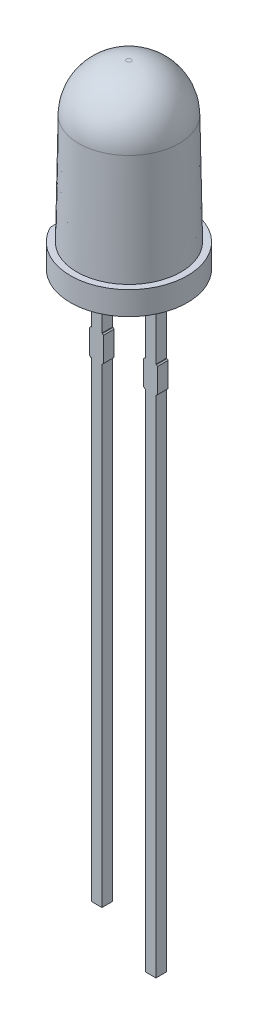
ISO-10303-21;
HEADER;
FILE_DESCRIPTION(('STEP AP214'),'2;1');
FILE_NAME('part.step','',(''),(''),'','','');
FILE_SCHEMA(('AUTOMOTIVE_DESIGN { 1 0 10303 214 1 1 1 1 }'));
ENDSEC;
DATA;
#1=APPLICATION_CONTEXT('core data for automotive mechanical design processes');
#2=APPLICATION_PROTOCOL_DEFINITION('international standard','automotive_design',2000,#1);
#3=PRODUCT_CONTEXT('',#1,'mechanical');
#4=PRODUCT('Part','Part','',(#3));
#5=PRODUCT_RELATED_PRODUCT_CATEGORY('part','',(#4));
#6=PRODUCT_DEFINITION_FORMATION('','',#4);
#7=PRODUCT_DEFINITION_CONTEXT('part definition',#1,'design');
#8=PRODUCT_DEFINITION('design','',#6,#7);
#9=PRODUCT_DEFINITION_SHAPE('','',#8);
#10=(LENGTH_UNIT() NAMED_UNIT(*) SI_UNIT(.MILLI.,.METRE.));
#11=(NAMED_UNIT(*) PLANE_ANGLE_UNIT() SI_UNIT($,.RADIAN.));
#12=(NAMED_UNIT(*) SI_UNIT($,.STERADIAN.) SOLID_ANGLE_UNIT());
#13=UNCERTAINTY_MEASURE_WITH_UNIT(LENGTH_MEASURE(1.E-05),#10,'distance_accuracy_value','');
#14=(GEOMETRIC_REPRESENTATION_CONTEXT(3) GLOBAL_UNCERTAINTY_ASSIGNED_CONTEXT((#13)) GLOBAL_UNIT_ASSIGNED_CONTEXT((#10,
#11,#12)) REPRESENTATION_CONTEXT('',''));
#15=CARTESIAN_POINT('',(0.,0.,0.));
#16=DIRECTION('',(0.,0.,1.));
#17=DIRECTION('',(1.,0.,0.));
#18=AXIS2_PLACEMENT_3D('',#15,#16,#17);
#19=CARTESIAN_POINT('',(-1.02,-28.,0.25));
#20=DIRECTION('',(-1.,0.,0.));
#21=DIRECTION('',(0.,0.,1.));
#22=AXIS2_PLACEMENT_3D('',#19,#20,#21);
#23=PLANE('',#22);
#24=DIRECTION('',(0.,1.,0.));
#25=VECTOR('',#24,1.);
#26=CARTESIAN_POINT('',(-1.02,-28.,0.25));
#27=LINE('',#26,#25);
#28=CARTESIAN_POINT('',(-1.02,-3.,0.25));
#29=VERTEX_POINT('',#28);
#30=CARTESIAN_POINT('',(-1.02,0.,0.25));
#31=VERTEX_POINT('',#30);
#32=EDGE_CURVE('E312',#29,#31,#27,.T.);
#33=ORIENTED_EDGE('',*,*,#32,.F.);
#34=DIRECTION('',(0.,0.,-1.));
#35=VECTOR('',#34,1.);
#36=CARTESIAN_POINT('',(-1.02,-3.,0.25));
#37=LINE('',#36,#35);
#38=CARTESIAN_POINT('',(-1.02,-3.,-0.25));
#39=VERTEX_POINT('',#38);
#40=EDGE_CURVE('E545',#29,#39,#37,.T.);
#41=ORIENTED_EDGE('',*,*,#40,.T.);
#42=DIRECTION('',(0.,1.,0.));
#43=VECTOR('',#42,1.);
#44=CARTESIAN_POINT('',(-1.02,-28.,-0.25));
#45=LINE('',#44,#43);
#46=CARTESIAN_POINT('',(-1.02,0.,-0.25));
#47=VERTEX_POINT('',#46);
#48=EDGE_CURVE('E361',#39,#47,#45,.T.);
#49=ORIENTED_EDGE('',*,*,#48,.T.);
#50=DIRECTION('',(0.,0.,1.));
#51=VECTOR('',#50,1.);
#52=CARTESIAN_POINT('',(-1.02,0.,0.25));
#53=LINE('',#52,#51);
#54=EDGE_CURVE('E478',#47,#31,#53,.T.);
#55=ORIENTED_EDGE('',*,*,#54,.T.);
#56=EDGE_LOOP('',(#33,#41,#49,#55));
#57=FACE_BOUND('',#56,.T.);
#58=ADVANCED_FACE('F41',(#57),#23,.F.);
#59=CARTESIAN_POINT('',(-1.52,-28.,0.25));
#60=DIRECTION('',(1.,0.,0.));
#61=DIRECTION('',(0.,0.,-1.));
#62=AXIS2_PLACEMENT_3D('',#59,#60,#61);
#63=PLANE('',#62);
#64=DIRECTION('',(0.,1.,0.));
#65=VECTOR('',#64,1.);
#66=CARTESIAN_POINT('',(-1.52,-28.,-0.25));
#67=LINE('',#66,#65);
#68=CARTESIAN_POINT('',(-1.52,-3.,-0.25));
#69=VERTEX_POINT('',#68);
#70=CARTESIAN_POINT('',(-1.52,0.,-0.25));
#71=VERTEX_POINT('',#70);
#72=EDGE_CURVE('E300',#69,#71,#67,.T.);
#73=ORIENTED_EDGE('',*,*,#72,.F.);
#74=DIRECTION('',(0.,0.,1.));
#75=VECTOR('',#74,1.);
#76=CARTESIAN_POINT('',(-1.52,-3.,0.25));
#77=LINE('',#76,#75);
#78=CARTESIAN_POINT('',(-1.52,-3.,0.25));
#79=VERTEX_POINT('',#78);
#80=EDGE_CURVE('E547',#69,#79,#77,.T.);
#81=ORIENTED_EDGE('',*,*,#80,.T.);
#82=DIRECTION('',(0.,1.,0.));
#83=VECTOR('',#82,1.);
#84=CARTESIAN_POINT('',(-1.52,-28.,0.25));
#85=LINE('',#84,#83);
#86=CARTESIAN_POINT('',(-1.52,0.,0.25));
#87=VERTEX_POINT('',#86);
#88=EDGE_CURVE('E299',#79,#87,#85,.T.);
#89=ORIENTED_EDGE('',*,*,#88,.T.);
#90=DIRECTION('',(0.,0.,-1.));
#91=VECTOR('',#90,1.);
#92=CARTESIAN_POINT('',(-1.52,0.,0.25));
#93=LINE('',#92,#91);
#94=EDGE_CURVE('E494',#87,#71,#93,.T.);
#95=ORIENTED_EDGE('',*,*,#94,.T.);
#96=EDGE_LOOP('',(#73,#81,#89,#95));
#97=FACE_BOUND('',#96,.T.);
#98=ADVANCED_FACE('F619',(#97),#63,.F.);
#99=CARTESIAN_POINT('',(1.52,-28.,0.25));
#100=DIRECTION('',(-1.,0.,0.));
#101=DIRECTION('',(0.,0.,1.));
#102=AXIS2_PLACEMENT_3D('',#99,#100,#101);
#103=PLANE('',#102);
#104=DIRECTION('',(0.,1.,0.));
#105=VECTOR('',#104,1.);
#106=CARTESIAN_POINT('',(1.52,-28.,0.25));
#107=LINE('',#106,#105);
#108=CARTESIAN_POINT('',(1.52,-3.,0.25));
#109=VERTEX_POINT('',#108);
#110=CARTESIAN_POINT('',(1.52,0.,0.25));
#111=VERTEX_POINT('',#110);
#112=EDGE_CURVE('E529',#109,#111,#107,.T.);
#113=ORIENTED_EDGE('',*,*,#112,.F.);
#114=DIRECTION('',(0.,0.,-1.));
#115=VECTOR('',#114,1.);
#116=CARTESIAN_POINT('',(1.52,-3.,0.25));
#117=LINE('',#116,#115);
#118=CARTESIAN_POINT('',(1.52,-3.,-0.25));
#119=VERTEX_POINT('',#118);
#120=EDGE_CURVE('E561',#109,#119,#117,.T.);
#121=ORIENTED_EDGE('',*,*,#120,.T.);
#122=DIRECTION('',(0.,1.,0.));
#123=VECTOR('',#122,1.);
#124=CARTESIAN_POINT('',(1.52,-28.,-0.25));
#125=LINE('',#124,#123);
#126=CARTESIAN_POINT('',(1.52,0.,-0.25));
#127=VERTEX_POINT('',#126);
#128=EDGE_CURVE('E536',#119,#127,#125,.T.);
#129=ORIENTED_EDGE('',*,*,#128,.T.);
#130=DIRECTION('',(0.,0.,1.));
#131=VECTOR('',#130,1.);
#132=CARTESIAN_POINT('',(1.52,0.,0.25));
#133=LINE('',#132,#131);
#134=EDGE_CURVE('E509',#127,#111,#133,.T.);
#135=ORIENTED_EDGE('',*,*,#134,.T.);
#136=EDGE_LOOP('',(#113,#121,#129,#135));
#137=FACE_BOUND('',#136,.T.);
#138=ADVANCED_FACE('F709',(#137),#103,.F.);
#139=CARTESIAN_POINT('',(1.02,-28.,0.25));
#140=DIRECTION('',(1.,0.,0.));
#141=DIRECTION('',(0.,0.,-1.));
#142=AXIS2_PLACEMENT_3D('',#139,#140,#141);
#143=PLANE('',#142);
#144=DIRECTION('',(0.,1.,0.));
#145=VECTOR('',#144,1.);
#146=CARTESIAN_POINT('',(1.02,-28.,-0.25));
#147=LINE('',#146,#145);
#148=CARTESIAN_POINT('',(1.02,-3.,-0.25));
#149=VERTEX_POINT('',#148);
#150=CARTESIAN_POINT('',(1.02,0.,-0.25));
#151=VERTEX_POINT('',#150);
#152=EDGE_CURVE('E535',#149,#151,#147,.T.);
#153=ORIENTED_EDGE('',*,*,#152,.F.);
#154=DIRECTION('',(0.,0.,1.));
#155=VECTOR('',#154,1.);
#156=CARTESIAN_POINT('',(1.02,-3.,0.25));
#157=LINE('',#156,#155);
#158=CARTESIAN_POINT('',(1.02,-3.,0.25));
#159=VERTEX_POINT('',#158);
#160=EDGE_CURVE('E486',#149,#159,#157,.T.);
#161=ORIENTED_EDGE('',*,*,#160,.T.);
#162=DIRECTION('',(0.,1.,0.));
#163=VECTOR('',#162,1.);
#164=CARTESIAN_POINT('',(1.02,-28.,0.25));
#165=LINE('',#164,#163);
#166=CARTESIAN_POINT('',(1.02,0.,0.25));
#167=VERTEX_POINT('',#166);
#168=EDGE_CURVE('E473',#159,#167,#165,.T.);
#169=ORIENTED_EDGE('',*,*,#168,.T.);
#170=DIRECTION('',(0.,0.,-1.));
#171=VECTOR('',#170,1.);
#172=CARTESIAN_POINT('',(1.02,0.,0.25));
#173=LINE('',#172,#171);
#174=EDGE_CURVE('E508',#167,#151,#173,.T.);
#175=ORIENTED_EDGE('',*,*,#174,.T.);
#176=EDGE_LOOP('',(#153,#161,#169,#175));
#177=FACE_BOUND('',#176,.T.);
#178=ADVANCED_FACE('F722',(#177),#143,.F.);
#179=CARTESIAN_POINT('',(0.,0.,0.));
#180=DIRECTION('',(0.,1.,0.));
#181=DIRECTION('',(0.,0.,1.));
#182=AXIS2_PLACEMENT_3D('',#179,#180,#181);
#183=PLANE('',#182);
#184=ORIENTED_EDGE('',*,*,#54,.F.);
#185=DIRECTION('',(1.,0.,0.));
#186=VECTOR('',#185,1.);
#187=CARTESIAN_POINT('',(-1.52,0.,-0.25));
#188=LINE('',#187,#186);
#189=EDGE_CURVE('E358',#71,#47,#188,.T.);
#190=ORIENTED_EDGE('',*,*,#189,.F.);
#191=ORIENTED_EDGE('',*,*,#94,.F.);
#192=DIRECTION('',(-1.,0.,0.));
#193=VECTOR('',#192,1.);
#194=CARTESIAN_POINT('',(-1.52,0.,0.25));
#195=LINE('',#194,#193);
#196=EDGE_CURVE('E481',#31,#87,#195,.T.);
#197=ORIENTED_EDGE('',*,*,#196,.F.);
#198=EDGE_LOOP('',(#184,#190,#191,#197));
#199=FACE_BOUND('',#198,.T.);
#200=CARTESIAN_POINT('',(0.,0.,0.));
#201=DIRECTION('',(0.,1.,0.));
#202=DIRECTION('',(0.,0.,1.));
#203=AXIS2_PLACEMENT_3D('',#200,#201,#202);
#204=CIRCLE('',#203,2.75);
#205=CARTESIAN_POINT('',(-2.45,0.,1.24899959967968));
#206=VERTEX_POINT('',#205);
#207=CARTESIAN_POINT('',(-2.45,0.,-1.24899959967968));
#208=VERTEX_POINT('',#207);
#209=EDGE_CURVE('E330',#206,#208,#204,.T.);
#210=ORIENTED_EDGE('',*,*,#209,.F.);
#211=DIRECTION('',(0.,0.,-1.));
#212=VECTOR('',#211,1.);
#213=CARTESIAN_POINT('',(-2.45,0.,-1.24899959967968));
#214=LINE('',#213,#212);
#215=EDGE_CURVE('E318',#206,#208,#214,.T.);
#216=ORIENTED_EDGE('',*,*,#215,.T.);
#217=EDGE_LOOP('',(#210,#216));
#218=FACE_BOUND('',#217,.T.);
#219=ORIENTED_EDGE('',*,*,#134,.F.);
#220=DIRECTION('',(1.,0.,0.));
#221=VECTOR('',#220,1.);
#222=CARTESIAN_POINT('',(1.02,0.,-0.25));
#223=LINE('',#222,#221);
#224=EDGE_CURVE('E524',#151,#127,#223,.T.);
#225=ORIENTED_EDGE('',*,*,#224,.F.);
#226=ORIENTED_EDGE('',*,*,#174,.F.);
#227=DIRECTION('',(-1.,0.,0.));
#228=VECTOR('',#227,1.);
#229=CARTESIAN_POINT('',(1.02,0.,0.25));
#230=LINE('',#229,#228);
#231=EDGE_CURVE('E505',#111,#167,#230,.T.);
#232=ORIENTED_EDGE('',*,*,#231,.F.);
#233=EDGE_LOOP('',(#219,#225,#226,#232));
#234=FACE_BOUND('',#233,.T.);
#235=ADVANCED_FACE('F626',(#199,#218,#234),#183,.F.);
#236=CARTESIAN_POINT('',(0.,1.1,0.));
#237=DIRECTION('',(0.,-1.,0.));
#238=DIRECTION('',(0.,0.,-1.));
#239=AXIS2_PLACEMENT_3D('',#236,#237,#238);
#240=CYLINDRICAL_SURFACE('',#239,2.75);
#241=CARTESIAN_POINT('',(0.,1.1,0.));
#242=DIRECTION('',(0.,1.,0.));
#243=DIRECTION('',(0.,0.,1.));
#244=AXIS2_PLACEMENT_3D('',#241,#242,#243);
#245=CIRCLE('',#244,2.75);
#246=CARTESIAN_POINT('',(-2.45,1.1,1.24899959967968));
#247=VERTEX_POINT('',#246);
#248=CARTESIAN_POINT('',(-2.45,1.1,-1.24899959967968));
#249=VERTEX_POINT('',#248);
#250=EDGE_CURVE('E338',#247,#249,#245,.T.);
#251=ORIENTED_EDGE('',*,*,#250,.F.);
#252=DIRECTION('',(0.,1.,0.));
#253=VECTOR('',#252,1.);
#254=CARTESIAN_POINT('',(-2.45,0.,1.24899959967968));
#255=LINE('',#254,#253);
#256=EDGE_CURVE('E322',#206,#247,#255,.T.);
#257=ORIENTED_EDGE('',*,*,#256,.F.);
#258=ORIENTED_EDGE('',*,*,#209,.T.);
#259=DIRECTION('',(0.,1.,0.));
#260=VECTOR('',#259,1.);
#261=CARTESIAN_POINT('',(-2.45,0.,-1.24899959967968));
#262=LINE('',#261,#260);
#263=EDGE_CURVE('E326',#208,#249,#262,.T.);
#264=ORIENTED_EDGE('',*,*,#263,.T.);
#265=EDGE_LOOP('',(#251,#257,#258,#264));
#266=FACE_BOUND('',#265,.T.);
#267=ADVANCED_FACE('F682',(#266),#240,.T.);
#268=CARTESIAN_POINT('',(0.,1.1,0.));
#269=DIRECTION('',(0.,1.,0.));
#270=DIRECTION('',(0.,0.,1.));
#271=AXIS2_PLACEMENT_3D('',#268,#269,#270);
#272=PLANE('',#271);
#273=DIRECTION('',(0.,0.,-1.));
#274=VECTOR('',#273,1.);
#275=CARTESIAN_POINT('',(-2.45,1.1,-1.24899959967968));
#276=LINE('',#275,#274);
#277=CARTESIAN_POINT('',(-2.45,1.1,0.));
#278=VERTEX_POINT('',#277);
#279=EDGE_CURVE('E323',#247,#278,#276,.T.);
#280=ORIENTED_EDGE('',*,*,#279,.F.);
#281=ORIENTED_EDGE('',*,*,#250,.T.);
#282=EDGE_CURVE('E317',#278,#249,#276,.T.);
#283=ORIENTED_EDGE('',*,*,#282,.F.);
#284=CARTESIAN_POINT('',(0.,1.1,0.));
#285=DIRECTION('',(0.,1.,0.));
#286=DIRECTION('',(0.,0.,1.));
#287=AXIS2_PLACEMENT_3D('',#284,#285,#286);
#288=CIRCLE('',#287,2.45);
#289=EDGE_CURVE('E333',#278,#278,#288,.T.);
#290=ORIENTED_EDGE('',*,*,#289,.F.);
#291=EDGE_LOOP('',(#280,#281,#283,#290));
#292=FACE_BOUND('',#291,.T.);
#293=ADVANCED_FACE('F685',(#292),#272,.T.);
#294=CARTESIAN_POINT('',(0.,8.5,0.));
#295=DIRECTION('',(0.,1.,0.));
#296=DIRECTION('',(0.,0.,1.));
#297=AXIS2_PLACEMENT_3D('',#294,#295,#296);
#298=PLANE('',#297);
#299=CARTESIAN_POINT('',(0.,8.5,0.));
#300=DIRECTION('',(0.,1.,0.));
#301=DIRECTION('',(0.,0.,1.));
#302=AXIS2_PLACEMENT_3D('',#299,#300,#301);
#303=CIRCLE('',#302,0.109763677520888);
#304=CARTESIAN_POINT('',(0.,8.5,0.109763677520888));
#305=VERTEX_POINT('',#304);
#306=EDGE_CURVE('E337',#305,#305,#303,.T.);
#307=ORIENTED_EDGE('',*,*,#306,.T.);
#308=EDGE_LOOP('',(#307));
#309=FACE_BOUND('',#308,.T.);
#310=ADVANCED_FACE('F690',(#309),#298,.T.);
#311=CARTESIAN_POINT('',(0.,1.1,0.));
#312=DIRECTION('',(0.,-1.,0.));
#313=DIRECTION('',(0.,0.,1.));
#314=AXIS2_PLACEMENT_3D('',#311,#312,#313);
#315=CONICAL_SURFACE('',#314,2.45,0.0174532925199433);
#316=CARTESIAN_POINT('',(0.,6.28926791448389,0.));
#317=DIRECTION('',(0.,1.,0.));
#318=DIRECTION('',(0.,0.,1.));
#319=AXIS2_PLACEMENT_3D('',#316,#317,#318);
#320=CIRCLE('',#319,2.35942099162277);
#321=CARTESIAN_POINT('',(0.,6.28926791448389,2.35942099162277));
#322=VERTEX_POINT('',#321);
#323=EDGE_CURVE('E348',#322,#322,#320,.F.);
#324=ORIENTED_EDGE('',*,*,#323,.T.);
#325=EDGE_LOOP('',(#324));
#326=FACE_BOUND('',#325,.T.);
#327=ORIENTED_EDGE('',*,*,#289,.T.);
#328=EDGE_LOOP('',(#327));
#329=FACE_BOUND('',#328,.T.);
#330=ADVANCED_FACE('F687',(#326,#329),#315,.T.);
#331=CARTESIAN_POINT('',(0.,6.25,0.));
#332=DIRECTION('',(0.,1.,0.));
#333=DIRECTION('',(0.,0.,1.));
#334=AXIS2_PLACEMENT_3D('',#331,#332,#333);
#335=DEGENERATE_TOROIDAL_SURFACE('',#334,0.109763677520888,2.25,.T.);
#336=ORIENTED_EDGE('',*,*,#323,.F.);
#337=EDGE_LOOP('',(#336));
#338=FACE_BOUND('',#337,.T.);
#339=ORIENTED_EDGE('',*,*,#306,.F.);
#340=EDGE_LOOP('',(#339));
#341=FACE_BOUND('',#340,.T.);
#342=ADVANCED_FACE('F689',(#338,#341),#335,.T.);
#343=CARTESIAN_POINT('',(-2.45,0.,-1.24899959967968));
#344=DIRECTION('',(1.,0.,0.));
#345=DIRECTION('',(0.,0.,-1.));
#346=AXIS2_PLACEMENT_3D('',#343,#344,#345);
#347=PLANE('',#346);
#348=ORIENTED_EDGE('',*,*,#279,.T.);
#349=ORIENTED_EDGE('',*,*,#282,.T.);
#350=ORIENTED_EDGE('',*,*,#263,.F.);
#351=ORIENTED_EDGE('',*,*,#215,.F.);
#352=ORIENTED_EDGE('',*,*,#256,.T.);
#353=EDGE_LOOP('',(#348,#349,#350,#351,#352));
#354=FACE_BOUND('',#353,.T.);
#355=ADVANCED_FACE('F676',(#354),#347,.F.);
#356=CARTESIAN_POINT('',(-1.02,-26.4,-0.25));
#357=VERTEX_POINT('',#356);
#358=CARTESIAN_POINT('',(-1.02,-4.25,-0.25));
#359=VERTEX_POINT('',#358);
#360=EDGE_CURVE('E307',#357,#359,#45,.T.);
#361=ORIENTED_EDGE('',*,*,#360,.T.);
#362=DIRECTION('',(0.,0.,1.));
#363=VECTOR('',#362,1.);
#364=CARTESIAN_POINT('',(-1.02,-4.25,0.25));
#365=LINE('',#364,#363);
#366=CARTESIAN_POINT('',(-1.02,-4.25,0.25));
#367=VERTEX_POINT('',#366);
#368=EDGE_CURVE('E292',#359,#367,#365,.T.);
#369=ORIENTED_EDGE('',*,*,#368,.T.);
#370=CARTESIAN_POINT('',(-1.02,-26.4,0.25));
#371=VERTEX_POINT('',#370);
#372=EDGE_CURVE('E313',#371,#367,#27,.T.);
#373=ORIENTED_EDGE('',*,*,#372,.F.);
#374=DIRECTION('',(0.,0.,1.));
#375=VECTOR('',#374,1.);
#376=CARTESIAN_POINT('',(-1.02,-26.4,0.25));
#377=LINE('',#376,#375);
#378=EDGE_CURVE('E353',#357,#371,#377,.T.);
#379=ORIENTED_EDGE('',*,*,#378,.F.);
#380=EDGE_LOOP('',(#361,#369,#373,#379));
#381=FACE_BOUND('',#380,.T.);
#382=ADVANCED_FACE('F656',(#381),#23,.F.);
#383=CARTESIAN_POINT('',(-1.52,-28.,0.25));
#384=DIRECTION('',(0.,0.,-1.));
#385=DIRECTION('',(-1.,0.,0.));
#386=AXIS2_PLACEMENT_3D('',#383,#384,#385);
#387=PLANE('',#386);
#388=DIRECTION('',(1.,0.,0.));
#389=VECTOR('',#388,1.);
#390=CARTESIAN_POINT('',(-1.595,-4.25,0.25));
#391=LINE('',#390,#389);
#392=CARTESIAN_POINT('',(-0.994999999999997,-4.25,0.25));
#393=VERTEX_POINT('',#392);
#394=EDGE_CURVE('E520',#367,#393,#391,.T.);
#395=ORIENTED_EDGE('',*,*,#394,.T.);
#396=DIRECTION('',(-0.707106781186548,-0.707106781186548,0.));
#397=VECTOR('',#396,1.);
#398=CARTESIAN_POINT('',(-0.994999999999997,-4.25,0.25));
#399=LINE('',#398,#397);
#400=CARTESIAN_POINT('',(-0.944999999999999,-4.2,0.25));
#401=VERTEX_POINT('',#400);
#402=EDGE_CURVE('E430',#393,#401,#399,.F.);
#403=ORIENTED_EDGE('',*,*,#402,.T.);
#404=DIRECTION('',(0.,1.,0.));
#405=VECTOR('',#404,1.);
#406=CARTESIAN_POINT('',(-0.945,-3.,0.25));
#407=LINE('',#406,#405);
#408=CARTESIAN_POINT('',(-0.945,-3.05,0.25));
#409=VERTEX_POINT('',#408);
#410=EDGE_CURVE('E467',#401,#409,#407,.T.);
#411=ORIENTED_EDGE('',*,*,#410,.T.);
#412=DIRECTION('',(0.707106781186547,-0.707106781186548,0.));
#413=VECTOR('',#412,1.);
#414=CARTESIAN_POINT('',(-0.945,-3.05,0.25));
#415=LINE('',#414,#413);
#416=CARTESIAN_POINT('',(-0.994999999999994,-3.,0.25));
#417=VERTEX_POINT('',#416);
#418=EDGE_CURVE('E427',#409,#417,#415,.F.);
#419=ORIENTED_EDGE('',*,*,#418,.T.);
#420=DIRECTION('',(-1.,0.,0.));
#421=VECTOR('',#420,1.);
#422=CARTESIAN_POINT('',(-1.595,-3.,0.25));
#423=LINE('',#422,#421);
#424=EDGE_CURVE('E501',#417,#29,#423,.T.);
#425=ORIENTED_EDGE('',*,*,#424,.T.);
#426=ORIENTED_EDGE('',*,*,#32,.T.);
#427=ORIENTED_EDGE('',*,*,#196,.T.);
#428=ORIENTED_EDGE('',*,*,#88,.F.);
#429=CARTESIAN_POINT('',(-1.54499999999999,-3.,0.25));
#430=VERTEX_POINT('',#429);
#431=EDGE_CURVE('E469',#79,#430,#423,.T.);
#432=ORIENTED_EDGE('',*,*,#431,.T.);
#433=DIRECTION('',(0.707106781186572,0.707106781186523,0.));
#434=VECTOR('',#433,1.);
#435=CARTESIAN_POINT('',(-1.54499999999999,-3.,0.25));
#436=LINE('',#435,#434);
#437=CARTESIAN_POINT('',(-1.595,-3.05,0.25));
#438=VERTEX_POINT('',#437);
#439=EDGE_CURVE('E422',#430,#438,#436,.F.);
#440=ORIENTED_EDGE('',*,*,#439,.T.);
#441=DIRECTION('',(0.,-1.,0.));
#442=VECTOR('',#441,1.);
#443=CARTESIAN_POINT('',(-1.595,-3.,0.25));
#444=LINE('',#443,#442);
#445=CARTESIAN_POINT('',(-1.595,-4.2,0.25));
#446=VERTEX_POINT('',#445);
#447=EDGE_CURVE('E518',#438,#446,#444,.T.);
#448=ORIENTED_EDGE('',*,*,#447,.T.);
#449=DIRECTION('',(-0.707106781186572,0.707106781186523,0.));
#450=VECTOR('',#449,1.);
#451=CARTESIAN_POINT('',(-1.595,-4.2,0.25));
#452=LINE('',#451,#450);
#453=CARTESIAN_POINT('',(-1.545,-4.25,0.25));
#454=VERTEX_POINT('',#453);
#455=EDGE_CURVE('E425',#446,#454,#452,.F.);
#456=ORIENTED_EDGE('',*,*,#455,.T.);
#457=CARTESIAN_POINT('',(-1.52,-4.25,0.25));
#458=VERTEX_POINT('',#457);
#459=EDGE_CURVE('E470',#454,#458,#391,.T.);
#460=ORIENTED_EDGE('',*,*,#459,.T.);
#461=CARTESIAN_POINT('',(-1.52,-26.4,0.25));
#462=VERTEX_POINT('',#461);
#463=EDGE_CURVE('E290',#462,#458,#85,.T.);
#464=ORIENTED_EDGE('',*,*,#463,.F.);
#465=DIRECTION('',(-1.,0.,0.));
#466=VECTOR('',#465,1.);
#467=CARTESIAN_POINT('',(-1.52,-26.4,0.25));
#468=LINE('',#467,#466);
#469=EDGE_CURVE('E357',#371,#462,#468,.T.);
#470=ORIENTED_EDGE('',*,*,#469,.F.);
#471=ORIENTED_EDGE('',*,*,#372,.T.);
#472=EDGE_LOOP('',(#395,#403,#411,#419,#425,#426,#427,#428,#432,#440,#448,#456,#460,#464,#470,#471));
#473=FACE_BOUND('',#472,.T.);
#474=ADVANCED_FACE('F629',(#473),#387,.F.);
#475=ORIENTED_EDGE('',*,*,#463,.T.);
#476=DIRECTION('',(0.,0.,-1.));
#477=VECTOR('',#476,1.);
#478=CARTESIAN_POINT('',(-1.52,-4.25,0.25));
#479=LINE('',#478,#477);
#480=CARTESIAN_POINT('',(-1.52,-4.25,-0.25));
#481=VERTEX_POINT('',#480);
#482=EDGE_CURVE('E274',#458,#481,#479,.T.);
#483=ORIENTED_EDGE('',*,*,#482,.T.);
#484=CARTESIAN_POINT('',(-1.52,-26.4,-0.25));
#485=VERTEX_POINT('',#484);
#486=EDGE_CURVE('E287',#485,#481,#67,.T.);
#487=ORIENTED_EDGE('',*,*,#486,.F.);
#488=DIRECTION('',(0.,0.,-1.));
#489=VECTOR('',#488,1.);
#490=CARTESIAN_POINT('',(-1.52,-26.4,0.25));
#491=LINE('',#490,#489);
#492=EDGE_CURVE('E362',#462,#485,#491,.T.);
#493=ORIENTED_EDGE('',*,*,#492,.F.);
#494=EDGE_LOOP('',(#475,#483,#487,#493));
#495=FACE_BOUND('',#494,.T.);
#496=ADVANCED_FACE('F285',(#495),#63,.F.);
#497=CARTESIAN_POINT('',(-1.52,-28.,-0.25));
#498=DIRECTION('',(0.,0.,1.));
#499=DIRECTION('',(1.,0.,0.));
#500=AXIS2_PLACEMENT_3D('',#497,#498,#499);
#501=PLANE('',#500);
#502=DIRECTION('',(0.,-1.,0.));
#503=VECTOR('',#502,1.);
#504=CARTESIAN_POINT('',(-0.945,-3.,-0.25));
#505=LINE('',#504,#503);
#506=CARTESIAN_POINT('',(-0.945,-3.05,-0.25));
#507=VERTEX_POINT('',#506);
#508=CARTESIAN_POINT('',(-0.944999999999999,-4.2,-0.25));
#509=VERTEX_POINT('',#508);
#510=EDGE_CURVE('E502',#507,#509,#505,.T.);
#511=ORIENTED_EDGE('',*,*,#510,.T.);
#512=DIRECTION('',(0.707106781186548,0.707106781186548,0.));
#513=VECTOR('',#512,1.);
#514=CARTESIAN_POINT('',(-0.994999999999997,-4.25,-0.25));
#515=LINE('',#514,#513);
#516=CARTESIAN_POINT('',(-0.994999999999997,-4.25,-0.25));
#517=VERTEX_POINT('',#516);
#518=EDGE_CURVE('E448',#509,#517,#515,.F.);
#519=ORIENTED_EDGE('',*,*,#518,.T.);
#520=DIRECTION('',(-1.,0.,0.));
#521=VECTOR('',#520,1.);
#522=CARTESIAN_POINT('',(-1.595,-4.25,-0.25));
#523=LINE('',#522,#521);
#524=EDGE_CURVE('E280',#517,#359,#523,.T.);
#525=ORIENTED_EDGE('',*,*,#524,.T.);
#526=ORIENTED_EDGE('',*,*,#360,.F.);
#527=DIRECTION('',(1.,0.,0.));
#528=VECTOR('',#527,1.);
#529=CARTESIAN_POINT('',(-1.52,-26.4,-0.25));
#530=LINE('',#529,#528);
#531=EDGE_CURVE('E297',#485,#357,#530,.T.);
#532=ORIENTED_EDGE('',*,*,#531,.F.);
#533=ORIENTED_EDGE('',*,*,#486,.T.);
#534=CARTESIAN_POINT('',(-1.545,-4.25,-0.25));
#535=VERTEX_POINT('',#534);
#536=EDGE_CURVE('E270',#481,#535,#523,.T.);
#537=ORIENTED_EDGE('',*,*,#536,.T.);
#538=DIRECTION('',(0.707106781186572,-0.707106781186523,0.));
#539=VECTOR('',#538,1.);
#540=CARTESIAN_POINT('',(-1.595,-4.2,-0.25));
#541=LINE('',#540,#539);
#542=CARTESIAN_POINT('',(-1.595,-4.2,-0.25));
#543=VERTEX_POINT('',#542);
#544=EDGE_CURVE('E442',#535,#543,#541,.F.);
#545=ORIENTED_EDGE('',*,*,#544,.T.);
#546=DIRECTION('',(0.,1.,0.));
#547=VECTOR('',#546,1.);
#548=CARTESIAN_POINT('',(-1.595,-3.,-0.25));
#549=LINE('',#548,#547);
#550=CARTESIAN_POINT('',(-1.595,-3.05,-0.25));
#551=VERTEX_POINT('',#550);
#552=EDGE_CURVE('E281',#543,#551,#549,.T.);
#553=ORIENTED_EDGE('',*,*,#552,.T.);
#554=DIRECTION('',(-0.707106781186572,-0.707106781186523,0.));
#555=VECTOR('',#554,1.);
#556=CARTESIAN_POINT('',(-1.54499999999999,-3.,-0.25));
#557=LINE('',#556,#555);
#558=CARTESIAN_POINT('',(-1.54499999999999,-3.,-0.25));
#559=VERTEX_POINT('',#558);
#560=EDGE_CURVE('E66',#551,#559,#557,.F.);
#561=ORIENTED_EDGE('',*,*,#560,.T.);
#562=DIRECTION('',(1.,0.,0.));
#563=VECTOR('',#562,1.);
#564=CARTESIAN_POINT('',(-1.595,-3.,-0.25));
#565=LINE('',#564,#563);
#566=EDGE_CURVE('E489',#559,#69,#565,.T.);
#567=ORIENTED_EDGE('',*,*,#566,.T.);
#568=ORIENTED_EDGE('',*,*,#72,.T.);
#569=ORIENTED_EDGE('',*,*,#189,.T.);
#570=ORIENTED_EDGE('',*,*,#48,.F.);
#571=CARTESIAN_POINT('',(-0.994999999999994,-3.,-0.25));
#572=VERTEX_POINT('',#571);
#573=EDGE_CURVE('E490',#39,#572,#565,.T.);
#574=ORIENTED_EDGE('',*,*,#573,.T.);
#575=DIRECTION('',(-0.707106781186547,0.707106781186548,0.));
#576=VECTOR('',#575,1.);
#577=CARTESIAN_POINT('',(-0.945,-3.05,-0.25));
#578=LINE('',#577,#576);
#579=EDGE_CURVE('E445',#572,#507,#578,.F.);
#580=ORIENTED_EDGE('',*,*,#579,.T.);
#581=EDGE_LOOP('',(#511,#519,#525,#526,#532,#533,#537,#545,#553,#561,#567,#568,#569,#570,#574,#580));
#582=FACE_BOUND('',#581,.T.);
#583=ADVANCED_FACE('F295',(#582),#501,.F.);
#584=CARTESIAN_POINT('',(0.,-26.4,0.));
#585=DIRECTION('',(0.,-1.,0.));
#586=DIRECTION('',(0.,0.,-1.));
#587=AXIS2_PLACEMENT_3D('',#584,#585,#586);
#588=PLANE('',#587);
#589=ORIENTED_EDGE('',*,*,#378,.T.);
#590=ORIENTED_EDGE('',*,*,#469,.T.);
#591=ORIENTED_EDGE('',*,*,#492,.T.);
#592=ORIENTED_EDGE('',*,*,#531,.T.);
#593=EDGE_LOOP('',(#589,#590,#591,#592));
#594=FACE_BOUND('',#593,.T.);
#595=ADVANCED_FACE('F764',(#594),#588,.T.);
#596=CARTESIAN_POINT('',(1.52,-28.,-0.25));
#597=VERTEX_POINT('',#596);
#598=CARTESIAN_POINT('',(1.52,-4.25,-0.25));
#599=VERTEX_POINT('',#598);
#600=EDGE_CURVE('E533',#597,#599,#125,.T.);
#601=ORIENTED_EDGE('',*,*,#600,.T.);
#602=DIRECTION('',(0.,0.,1.));
#603=VECTOR('',#602,1.);
#604=CARTESIAN_POINT('',(1.52,-4.25,0.25));
#605=LINE('',#604,#603);
#606=CARTESIAN_POINT('',(1.52,-4.25,0.25));
#607=VERTEX_POINT('',#606);
#608=EDGE_CURVE('E484',#599,#607,#605,.T.);
#609=ORIENTED_EDGE('',*,*,#608,.T.);
#610=CARTESIAN_POINT('',(1.52,-28.,0.25));
#611=VERTEX_POINT('',#610);
#612=EDGE_CURVE('E482',#611,#607,#107,.T.);
#613=ORIENTED_EDGE('',*,*,#612,.F.);
#614=DIRECTION('',(0.,0.,1.));
#615=VECTOR('',#614,1.);
#616=CARTESIAN_POINT('',(1.52,-28.,0.25));
#617=LINE('',#616,#615);
#618=EDGE_CURVE('E499',#597,#611,#617,.T.);
#619=ORIENTED_EDGE('',*,*,#618,.F.);
#620=EDGE_LOOP('',(#601,#609,#613,#619));
#621=FACE_BOUND('',#620,.T.);
#622=ADVANCED_FACE('F752',(#621),#103,.F.);
#623=CARTESIAN_POINT('',(1.02,-28.,0.25));
#624=DIRECTION('',(0.,0.,-1.));
#625=DIRECTION('',(-1.,0.,0.));
#626=AXIS2_PLACEMENT_3D('',#623,#624,#625);
#627=PLANE('',#626);
#628=DIRECTION('',(1.,0.,0.));
#629=VECTOR('',#628,1.);
#630=CARTESIAN_POINT('',(0.945000000000001,-4.25,0.25));
#631=LINE('',#630,#629);
#632=CARTESIAN_POINT('',(1.545,-4.25,0.25));
#633=VERTEX_POINT('',#632);
#634=EDGE_CURVE('E512',#607,#633,#631,.T.);
#635=ORIENTED_EDGE('',*,*,#634,.T.);
#636=DIRECTION('',(-0.707106781186549,-0.707106781186546,0.));
#637=VECTOR('',#636,1.);
#638=CARTESIAN_POINT('',(1.545,-4.25,0.25));
#639=LINE('',#638,#637);
#640=CARTESIAN_POINT('',(1.595,-4.2,0.25));
#641=VERTEX_POINT('',#640);
#642=EDGE_CURVE('E379',#633,#641,#639,.F.);
#643=ORIENTED_EDGE('',*,*,#642,.T.);
#644=DIRECTION('',(0.,1.,0.));
#645=VECTOR('',#644,1.);
#646=CARTESIAN_POINT('',(1.595,-3.,0.25));
#647=LINE('',#646,#645);
#648=CARTESIAN_POINT('',(1.595,-3.05,0.25));
#649=VERTEX_POINT('',#648);
#650=EDGE_CURVE('E580',#641,#649,#647,.T.);
#651=ORIENTED_EDGE('',*,*,#650,.T.);
#652=DIRECTION('',(0.707106781186548,-0.707106781186548,0.));
#653=VECTOR('',#652,1.);
#654=CARTESIAN_POINT('',(1.595,-3.05,0.25));
#655=LINE('',#654,#653);
#656=CARTESIAN_POINT('',(1.54500000000001,-3.,0.25));
#657=VERTEX_POINT('',#656);
#658=EDGE_CURVE('E376',#649,#657,#655,.F.);
#659=ORIENTED_EDGE('',*,*,#658,.T.);
#660=DIRECTION('',(-1.,0.,0.));
#661=VECTOR('',#660,1.);
#662=CARTESIAN_POINT('',(0.945,-3.,0.25));
#663=LINE('',#662,#661);
#664=EDGE_CURVE('E464',#657,#109,#663,.T.);
#665=ORIENTED_EDGE('',*,*,#664,.T.);
#666=ORIENTED_EDGE('',*,*,#112,.T.);
#667=ORIENTED_EDGE('',*,*,#231,.T.);
#668=ORIENTED_EDGE('',*,*,#168,.F.);
#669=CARTESIAN_POINT('',(0.995000000000005,-3.,0.25));
#670=VERTEX_POINT('',#669);
#671=EDGE_CURVE('E567',#159,#670,#663,.T.);
#672=ORIENTED_EDGE('',*,*,#671,.T.);
#673=DIRECTION('',(0.707106781186571,0.707106781186524,0.));
#674=VECTOR('',#673,1.);
#675=CARTESIAN_POINT('',(0.995000000000005,-3.,0.25));
#676=LINE('',#675,#674);
#677=CARTESIAN_POINT('',(0.945,-3.05,0.25));
#678=VERTEX_POINT('',#677);
#679=EDGE_CURVE('E373',#670,#678,#676,.F.);
#680=ORIENTED_EDGE('',*,*,#679,.T.);
#681=DIRECTION('',(0.,-1.,0.));
#682=VECTOR('',#681,1.);
#683=CARTESIAN_POINT('',(0.945,-3.,0.25));
#684=LINE('',#683,#682);
#685=CARTESIAN_POINT('',(0.945000000000001,-4.2,0.25));
#686=VERTEX_POINT('',#685);
#687=EDGE_CURVE('E516',#678,#686,#684,.T.);
#688=ORIENTED_EDGE('',*,*,#687,.T.);
#689=DIRECTION('',(-0.707106781186569,0.707106781186526,0.));
#690=VECTOR('',#689,1.);
#691=CARTESIAN_POINT('',(0.945000000000001,-4.2,0.25));
#692=LINE('',#691,#690);
#693=CARTESIAN_POINT('',(0.995000000000002,-4.25,0.25));
#694=VERTEX_POINT('',#693);
#695=EDGE_CURVE('E370',#686,#694,#692,.F.);
#696=ORIENTED_EDGE('',*,*,#695,.T.);
#697=CARTESIAN_POINT('',(1.02,-4.25,0.25));
#698=VERTEX_POINT('',#697);
#699=EDGE_CURVE('E515',#694,#698,#631,.T.);
#700=ORIENTED_EDGE('',*,*,#699,.T.);
#701=CARTESIAN_POINT('',(1.02,-28.,0.25));
#702=VERTEX_POINT('',#701);
#703=EDGE_CURVE('E475',#702,#698,#165,.T.);
#704=ORIENTED_EDGE('',*,*,#703,.F.);
#705=DIRECTION('',(-1.,0.,0.));
#706=VECTOR('',#705,1.);
#707=CARTESIAN_POINT('',(1.02,-28.,0.25));
#708=LINE('',#707,#706);
#709=EDGE_CURVE('E496',#611,#702,#708,.T.);
#710=ORIENTED_EDGE('',*,*,#709,.F.);
#711=ORIENTED_EDGE('',*,*,#612,.T.);
#712=EDGE_LOOP('',(#635,#643,#651,#659,#665,#666,#667,#668,#672,#680,#688,#696,#700,#704,#710,#711));
#713=FACE_BOUND('',#712,.T.);
#714=ADVANCED_FACE('F746',(#713),#627,.F.);
#715=ORIENTED_EDGE('',*,*,#703,.T.);
#716=DIRECTION('',(0.,0.,-1.));
#717=VECTOR('',#716,1.);
#718=CARTESIAN_POINT('',(1.02,-4.25,0.25));
#719=LINE('',#718,#717);
#720=CARTESIAN_POINT('',(1.02,-4.25,-0.25));
#721=VERTEX_POINT('',#720);
#722=EDGE_CURVE('E487',#698,#721,#719,.T.);
#723=ORIENTED_EDGE('',*,*,#722,.T.);
#724=CARTESIAN_POINT('',(1.02,-28.,-0.25));
#725=VERTEX_POINT('',#724);
#726=EDGE_CURVE('E476',#725,#721,#147,.T.);
#727=ORIENTED_EDGE('',*,*,#726,.F.);
#728=DIRECTION('',(0.,0.,-1.));
#729=VECTOR('',#728,1.);
#730=CARTESIAN_POINT('',(1.02,-28.,0.25));
#731=LINE('',#730,#729);
#732=EDGE_CURVE('E498',#702,#725,#731,.T.);
#733=ORIENTED_EDGE('',*,*,#732,.F.);
#734=EDGE_LOOP('',(#715,#723,#727,#733));
#735=FACE_BOUND('',#734,.T.);
#736=ADVANCED_FACE('F751',(#735),#143,.F.);
#737=CARTESIAN_POINT('',(1.02,-28.,-0.25));
#738=DIRECTION('',(0.,0.,1.));
#739=DIRECTION('',(1.,0.,0.));
#740=AXIS2_PLACEMENT_3D('',#737,#738,#739);
#741=PLANE('',#740);
#742=DIRECTION('',(0.,-1.,0.));
#743=VECTOR('',#742,1.);
#744=CARTESIAN_POINT('',(1.595,-3.,-0.25));
#745=LINE('',#744,#743);
#746=CARTESIAN_POINT('',(1.595,-3.05,-0.25));
#747=VERTEX_POINT('',#746);
#748=CARTESIAN_POINT('',(1.595,-4.2,-0.25));
#749=VERTEX_POINT('',#748);
#750=EDGE_CURVE('E461',#747,#749,#745,.T.);
#751=ORIENTED_EDGE('',*,*,#750,.T.);
#752=DIRECTION('',(0.707106781186549,0.707106781186546,0.));
#753=VECTOR('',#752,1.);
#754=CARTESIAN_POINT('',(1.545,-4.25,-0.25));
#755=LINE('',#754,#753);
#756=CARTESIAN_POINT('',(1.545,-4.25,-0.25));
#757=VERTEX_POINT('',#756);
#758=EDGE_CURVE('E398',#749,#757,#755,.F.);
#759=ORIENTED_EDGE('',*,*,#758,.T.);
#760=DIRECTION('',(-1.,0.,0.));
#761=VECTOR('',#760,1.);
#762=CARTESIAN_POINT('',(0.945000000000001,-4.25,-0.25));
#763=LINE('',#762,#761);
#764=EDGE_CURVE('E551',#757,#599,#763,.T.);
#765=ORIENTED_EDGE('',*,*,#764,.T.);
#766=ORIENTED_EDGE('',*,*,#600,.F.);
#767=DIRECTION('',(1.,0.,0.));
#768=VECTOR('',#767,1.);
#769=CARTESIAN_POINT('',(1.02,-28.,-0.25));
#770=LINE('',#769,#768);
#771=EDGE_CURVE('E576',#725,#597,#770,.T.);
#772=ORIENTED_EDGE('',*,*,#771,.F.);
#773=ORIENTED_EDGE('',*,*,#726,.T.);
#774=CARTESIAN_POINT('',(0.995000000000002,-4.25,-0.25));
#775=VERTEX_POINT('',#774);
#776=EDGE_CURVE('E565',#721,#775,#763,.T.);
#777=ORIENTED_EDGE('',*,*,#776,.T.);
#778=DIRECTION('',(0.707106781186569,-0.707106781186526,0.));
#779=VECTOR('',#778,1.);
#780=CARTESIAN_POINT('',(0.945000000000001,-4.2,-0.25));
#781=LINE('',#780,#779);
#782=CARTESIAN_POINT('',(0.945000000000001,-4.2,-0.25));
#783=VERTEX_POINT('',#782);
#784=EDGE_CURVE('E389',#775,#783,#781,.F.);
#785=ORIENTED_EDGE('',*,*,#784,.T.);
#786=DIRECTION('',(0.,1.,0.));
#787=VECTOR('',#786,1.);
#788=CARTESIAN_POINT('',(0.945,-3.,-0.25));
#789=LINE('',#788,#787);
#790=CARTESIAN_POINT('',(0.945,-3.05,-0.25));
#791=VERTEX_POINT('',#790);
#792=EDGE_CURVE('E542',#783,#791,#789,.T.);
#793=ORIENTED_EDGE('',*,*,#792,.T.);
#794=DIRECTION('',(-0.707106781186571,-0.707106781186524,0.));
#795=VECTOR('',#794,1.);
#796=CARTESIAN_POINT('',(0.995000000000005,-3.,-0.25));
#797=LINE('',#796,#795);
#798=CARTESIAN_POINT('',(0.995000000000005,-3.,-0.25));
#799=VERTEX_POINT('',#798);
#800=EDGE_CURVE('E392',#791,#799,#797,.F.);
#801=ORIENTED_EDGE('',*,*,#800,.T.);
#802=DIRECTION('',(1.,0.,0.));
#803=VECTOR('',#802,1.);
#804=CARTESIAN_POINT('',(0.945,-3.,-0.25));
#805=LINE('',#804,#803);
#806=EDGE_CURVE('E541',#799,#149,#805,.T.);
#807=ORIENTED_EDGE('',*,*,#806,.T.);
#808=ORIENTED_EDGE('',*,*,#152,.T.);
#809=ORIENTED_EDGE('',*,*,#224,.T.);
#810=ORIENTED_EDGE('',*,*,#128,.F.);
#811=CARTESIAN_POINT('',(1.54500000000001,-3.,-0.25));
#812=VERTEX_POINT('',#811);
#813=EDGE_CURVE('E463',#119,#812,#805,.T.);
#814=ORIENTED_EDGE('',*,*,#813,.T.);
#815=DIRECTION('',(-0.707106781186548,0.707106781186548,0.));
#816=VECTOR('',#815,1.);
#817=CARTESIAN_POINT('',(1.595,-3.05,-0.25));
#818=LINE('',#817,#816);
#819=EDGE_CURVE('E395',#812,#747,#818,.F.);
#820=ORIENTED_EDGE('',*,*,#819,.T.);
#821=EDGE_LOOP('',(#751,#759,#765,#766,#772,#773,#777,#785,#793,#801,#807,#808,#809,#810,#814,#820));
#822=FACE_BOUND('',#821,.T.);
#823=ADVANCED_FACE('F774',(#822),#741,.F.);
#824=CARTESIAN_POINT('',(0.,-28.,0.));
#825=DIRECTION('',(0.,-1.,0.));
#826=DIRECTION('',(0.,0.,-1.));
#827=AXIS2_PLACEMENT_3D('',#824,#825,#826);
#828=PLANE('',#827);
#829=ORIENTED_EDGE('',*,*,#618,.T.);
#830=ORIENTED_EDGE('',*,*,#709,.T.);
#831=ORIENTED_EDGE('',*,*,#732,.T.);
#832=ORIENTED_EDGE('',*,*,#771,.T.);
#833=EDGE_LOOP('',(#829,#830,#831,#832));
#834=FACE_BOUND('',#833,.T.);
#835=ADVANCED_FACE('F784',(#834),#828,.T.);
#836=CARTESIAN_POINT('',(0.945,-3.,-1.65890028036054));
#837=DIRECTION('',(-1.,0.,0.));
#838=DIRECTION('',(0.,-1.,0.));
#839=AXIS2_PLACEMENT_3D('',#836,#837,#838);
#840=PLANE('',#839);
#841=ORIENTED_EDGE('',*,*,#687,.F.);
#842=DIRECTION('',(0.,0.,-1.));
#843=VECTOR('',#842,1.);
#844=CARTESIAN_POINT('',(0.945,-3.05,-1.65890028036054));
#845=LINE('',#844,#843);
#846=EDGE_CURVE('E412',#678,#791,#845,.T.);
#847=ORIENTED_EDGE('',*,*,#846,.T.);
#848=ORIENTED_EDGE('',*,*,#792,.F.);
#849=DIRECTION('',(0.,0.,1.));
#850=VECTOR('',#849,1.);
#851=CARTESIAN_POINT('',(0.945000000000001,-4.2,-1.65890028036054));
#852=LINE('',#851,#850);
#853=EDGE_CURVE('E408',#783,#686,#852,.T.);
#854=ORIENTED_EDGE('',*,*,#853,.T.);
#855=EDGE_LOOP('',(#841,#847,#848,#854));
#856=FACE_BOUND('',#855,.T.);
#857=ADVANCED_FACE('F792',(#856),#840,.T.);
#858=CARTESIAN_POINT('',(0.945000000000001,-4.25,-1.65890028036054));
#859=DIRECTION('',(0.,-1.,0.));
#860=DIRECTION('',(0.,0.,-1.));
#861=AXIS2_PLACEMENT_3D('',#858,#859,#860);
#862=PLANE('',#861);
#863=ORIENTED_EDGE('',*,*,#699,.F.);
#864=DIRECTION('',(0.,0.,-1.));
#865=VECTOR('',#864,1.);
#866=CARTESIAN_POINT('',(0.995000000000002,-4.25,-1.65890028036054));
#867=LINE('',#866,#865);
#868=EDGE_CURVE('E415',#694,#775,#867,.T.);
#869=ORIENTED_EDGE('',*,*,#868,.T.);
#870=ORIENTED_EDGE('',*,*,#776,.F.);
#871=ORIENTED_EDGE('',*,*,#722,.F.);
#872=EDGE_LOOP('',(#863,#869,#870,#871));
#873=FACE_BOUND('',#872,.T.);
#874=ADVANCED_FACE('F800',(#873),#862,.T.);
#875=CARTESIAN_POINT('',(0.945,-3.,-1.65890028036054));
#876=DIRECTION('',(0.,1.,0.));
#877=DIRECTION('',(0.,0.,1.));
#878=AXIS2_PLACEMENT_3D('',#875,#876,#877);
#879=PLANE('',#878);
#880=ORIENTED_EDGE('',*,*,#806,.F.);
#881=DIRECTION('',(0.,0.,1.));
#882=VECTOR('',#881,1.);
#883=CARTESIAN_POINT('',(0.995000000000005,-3.,-1.65890028036054));
#884=LINE('',#883,#882);
#885=EDGE_CURVE('E404',#799,#670,#884,.T.);
#886=ORIENTED_EDGE('',*,*,#885,.T.);
#887=ORIENTED_EDGE('',*,*,#671,.F.);
#888=ORIENTED_EDGE('',*,*,#160,.F.);
#889=EDGE_LOOP('',(#880,#886,#887,#888));
#890=FACE_BOUND('',#889,.T.);
#891=ADVANCED_FACE('F808',(#890),#879,.T.);
#892=ORIENTED_EDGE('',*,*,#664,.F.);
#893=DIRECTION('',(0.,0.,-1.));
#894=VECTOR('',#893,1.);
#895=CARTESIAN_POINT('',(1.54500000000001,-3.,-1.65890028036054));
#896=LINE('',#895,#894);
#897=EDGE_CURVE('E401',#657,#812,#896,.T.);
#898=ORIENTED_EDGE('',*,*,#897,.T.);
#899=ORIENTED_EDGE('',*,*,#813,.F.);
#900=ORIENTED_EDGE('',*,*,#120,.F.);
#901=EDGE_LOOP('',(#892,#898,#899,#900));
#902=FACE_BOUND('',#901,.T.);
#903=ADVANCED_FACE('F817',(#902),#879,.T.);
#904=ORIENTED_EDGE('',*,*,#764,.F.);
#905=DIRECTION('',(0.,0.,1.));
#906=VECTOR('',#905,1.);
#907=CARTESIAN_POINT('',(1.545,-4.25,-1.65890028036054));
#908=LINE('',#907,#906);
#909=EDGE_CURVE('E352',#757,#633,#908,.T.);
#910=ORIENTED_EDGE('',*,*,#909,.T.);
#911=ORIENTED_EDGE('',*,*,#634,.F.);
#912=ORIENTED_EDGE('',*,*,#608,.F.);
#913=EDGE_LOOP('',(#904,#910,#911,#912));
#914=FACE_BOUND('',#913,.T.);
#915=ADVANCED_FACE('F811',(#914),#862,.T.);
#916=CARTESIAN_POINT('',(1.595,-3.,-1.65890028036054));
#917=DIRECTION('',(1.,0.,0.));
#918=DIRECTION('',(0.,1.,0.));
#919=AXIS2_PLACEMENT_3D('',#916,#917,#918);
#920=PLANE('',#919);
#921=ORIENTED_EDGE('',*,*,#650,.F.);
#922=DIRECTION('',(0.,0.,-1.));
#923=VECTOR('',#922,1.);
#924=CARTESIAN_POINT('',(1.595,-4.2,-1.65890028036054));
#925=LINE('',#924,#923);
#926=EDGE_CURVE('E386',#641,#749,#925,.T.);
#927=ORIENTED_EDGE('',*,*,#926,.T.);
#928=ORIENTED_EDGE('',*,*,#750,.F.);
#929=DIRECTION('',(0.,0.,1.));
#930=VECTOR('',#929,1.);
#931=CARTESIAN_POINT('',(1.595,-3.05,-1.65890028036054));
#932=LINE('',#931,#930);
#933=EDGE_CURVE('E382',#747,#649,#932,.T.);
#934=ORIENTED_EDGE('',*,*,#933,.T.);
#935=EDGE_LOOP('',(#921,#927,#928,#934));
#936=FACE_BOUND('',#935,.T.);
#937=ADVANCED_FACE('F831',(#936),#920,.T.);
#938=CARTESIAN_POINT('',(-1.595,-3.,-1.65890028036054));
#939=DIRECTION('',(-1.,0.,0.));
#940=DIRECTION('',(0.,0.,1.));
#941=AXIS2_PLACEMENT_3D('',#938,#939,#940);
#942=PLANE('',#941);
#943=ORIENTED_EDGE('',*,*,#552,.F.);
#944=DIRECTION('',(0.,0.,1.));
#945=VECTOR('',#944,1.);
#946=CARTESIAN_POINT('',(-1.595,-4.2,-1.65890028036054));
#947=LINE('',#946,#945);
#948=EDGE_CURVE('E456',#543,#446,#947,.T.);
#949=ORIENTED_EDGE('',*,*,#948,.T.);
#950=ORIENTED_EDGE('',*,*,#447,.F.);
#951=DIRECTION('',(0.,0.,-1.));
#952=VECTOR('',#951,1.);
#953=CARTESIAN_POINT('',(-1.595,-3.05,-1.65890028036054));
#954=LINE('',#953,#952);
#955=EDGE_CURVE('E453',#438,#551,#954,.T.);
#956=ORIENTED_EDGE('',*,*,#955,.T.);
#957=EDGE_LOOP('',(#943,#949,#950,#956));
#958=FACE_BOUND('',#957,.T.);
#959=ADVANCED_FACE('F838',(#958),#942,.T.);
#960=CARTESIAN_POINT('',(-1.595,-4.25,-1.65890028036054));
#961=DIRECTION('',(0.,-1.,0.));
#962=DIRECTION('',(0.,0.,-1.));
#963=AXIS2_PLACEMENT_3D('',#960,#961,#962);
#964=PLANE('',#963);
#965=ORIENTED_EDGE('',*,*,#459,.F.);
#966=DIRECTION('',(0.,0.,-1.));
#967=VECTOR('',#966,1.);
#968=CARTESIAN_POINT('',(-1.545,-4.25,-1.65890028036054));
#969=LINE('',#968,#967);
#970=EDGE_CURVE('E51',#454,#535,#969,.T.);
#971=ORIENTED_EDGE('',*,*,#970,.T.);
#972=ORIENTED_EDGE('',*,*,#536,.F.);
#973=ORIENTED_EDGE('',*,*,#482,.F.);
#974=EDGE_LOOP('',(#965,#971,#972,#973));
#975=FACE_BOUND('',#974,.T.);
#976=ADVANCED_FACE('F273',(#975),#964,.T.);
#977=CARTESIAN_POINT('',(-1.595,-3.,-1.65890028036054));
#978=DIRECTION('',(0.,1.,0.));
#979=DIRECTION('',(0.,0.,1.));
#980=AXIS2_PLACEMENT_3D('',#977,#978,#979);
#981=PLANE('',#980);
#982=ORIENTED_EDGE('',*,*,#566,.F.);
#983=DIRECTION('',(0.,0.,1.));
#984=VECTOR('',#983,1.);
#985=CARTESIAN_POINT('',(-1.54499999999999,-3.,-1.65890028036054));
#986=LINE('',#985,#984);
#987=EDGE_CURVE('E13',#559,#430,#986,.T.);
#988=ORIENTED_EDGE('',*,*,#987,.T.);
#989=ORIENTED_EDGE('',*,*,#431,.F.);
#990=ORIENTED_EDGE('',*,*,#80,.F.);
#991=EDGE_LOOP('',(#982,#988,#989,#990));
#992=FACE_BOUND('',#991,.T.);
#993=ADVANCED_FACE('F670',(#992),#981,.T.);
#994=ORIENTED_EDGE('',*,*,#424,.F.);
#995=DIRECTION('',(0.,0.,-1.));
#996=VECTOR('',#995,1.);
#997=CARTESIAN_POINT('',(-0.994999999999994,-3.,-1.65890028036054));
#998=LINE('',#997,#996);
#999=EDGE_CURVE('E58',#417,#572,#998,.T.);
#1000=ORIENTED_EDGE('',*,*,#999,.T.);
#1001=ORIENTED_EDGE('',*,*,#573,.F.);
#1002=ORIENTED_EDGE('',*,*,#40,.F.);
#1003=EDGE_LOOP('',(#994,#1000,#1001,#1002));
#1004=FACE_BOUND('',#1003,.T.);
#1005=ADVANCED_FACE('F634',(#1004),#981,.T.);
#1006=ORIENTED_EDGE('',*,*,#524,.F.);
#1007=DIRECTION('',(0.,0.,1.));
#1008=VECTOR('',#1007,1.);
#1009=CARTESIAN_POINT('',(-0.994999999999997,-4.25,-1.65890028036054));
#1010=LINE('',#1009,#1008);
#1011=EDGE_CURVE('E418',#517,#393,#1010,.T.);
#1012=ORIENTED_EDGE('',*,*,#1011,.T.);
#1013=ORIENTED_EDGE('',*,*,#394,.F.);
#1014=ORIENTED_EDGE('',*,*,#368,.F.);
#1015=EDGE_LOOP('',(#1006,#1012,#1013,#1014));
#1016=FACE_BOUND('',#1015,.T.);
#1017=ADVANCED_FACE('F651',(#1016),#964,.T.);
#1018=CARTESIAN_POINT('',(-0.945,-3.,-1.65890028036054));
#1019=DIRECTION('',(1.,0.,0.));
#1020=DIRECTION('',(0.,1.,0.));
#1021=AXIS2_PLACEMENT_3D('',#1018,#1019,#1020);
#1022=PLANE('',#1021);
#1023=ORIENTED_EDGE('',*,*,#410,.F.);
#1024=DIRECTION('',(0.,0.,-1.));
#1025=VECTOR('',#1024,1.);
#1026=CARTESIAN_POINT('',(-0.944999999999999,-4.2,-1.65890028036054));
#1027=LINE('',#1026,#1025);
#1028=EDGE_CURVE('E437',#401,#509,#1027,.T.);
#1029=ORIENTED_EDGE('',*,*,#1028,.T.);
#1030=ORIENTED_EDGE('',*,*,#510,.F.);
#1031=DIRECTION('',(0.,0.,1.));
#1032=VECTOR('',#1031,1.);
#1033=CARTESIAN_POINT('',(-0.945,-3.05,-1.65890028036054));
#1034=LINE('',#1033,#1032);
#1035=EDGE_CURVE('E433',#507,#409,#1034,.T.);
#1036=ORIENTED_EDGE('',*,*,#1035,.T.);
#1037=EDGE_LOOP('',(#1023,#1029,#1030,#1036));
#1038=FACE_BOUND('',#1037,.T.);
#1039=ADVANCED_FACE('F642',(#1038),#1022,.T.);
#1040=CARTESIAN_POINT('',(1.545,-4.25,-1.65890028036054));
#1041=DIRECTION('',(-0.707106781186546,0.707106781186549,0.));
#1042=DIRECTION('',(0.,0.,1.));
#1043=AXIS2_PLACEMENT_3D('',#1040,#1041,#1042);
#1044=PLANE('',#1043);
#1045=ORIENTED_EDGE('',*,*,#758,.F.);
#1046=ORIENTED_EDGE('',*,*,#926,.F.);
#1047=ORIENTED_EDGE('',*,*,#642,.F.);
#1048=ORIENTED_EDGE('',*,*,#909,.F.);
#1049=EDGE_LOOP('',(#1045,#1046,#1047,#1048));
#1050=FACE_BOUND('',#1049,.T.);
#1051=ADVANCED_FACE('F875',(#1050),#1044,.F.);
#1052=CARTESIAN_POINT('',(1.595,-3.05,-1.65890028036054));
#1053=DIRECTION('',(-0.707106781186548,-0.707106781186548,0.));
#1054=DIRECTION('',(0.,0.,1.));
#1055=AXIS2_PLACEMENT_3D('',#1052,#1053,#1054);
#1056=PLANE('',#1055);
#1057=ORIENTED_EDGE('',*,*,#819,.F.);
#1058=ORIENTED_EDGE('',*,*,#897,.F.);
#1059=ORIENTED_EDGE('',*,*,#658,.F.);
#1060=ORIENTED_EDGE('',*,*,#933,.F.);
#1061=EDGE_LOOP('',(#1057,#1058,#1059,#1060));
#1062=FACE_BOUND('',#1061,.T.);
#1063=ADVANCED_FACE('F882',(#1062),#1056,.F.);
#1064=CARTESIAN_POINT('',(0.995000000000005,-3.,-1.65890028036054));
#1065=DIRECTION('',(0.707106781186524,-0.707106781186571,0.));
#1066=DIRECTION('',(0.,0.,1.));
#1067=AXIS2_PLACEMENT_3D('',#1064,#1065,#1066);
#1068=PLANE('',#1067);
#1069=ORIENTED_EDGE('',*,*,#800,.F.);
#1070=ORIENTED_EDGE('',*,*,#846,.F.);
#1071=ORIENTED_EDGE('',*,*,#679,.F.);
#1072=ORIENTED_EDGE('',*,*,#885,.F.);
#1073=EDGE_LOOP('',(#1069,#1070,#1071,#1072));
#1074=FACE_BOUND('',#1073,.T.);
#1075=ADVANCED_FACE('F890',(#1074),#1068,.F.);
#1076=CARTESIAN_POINT('',(0.945000000000001,-4.2,-1.65890028036054));
#1077=DIRECTION('',(0.707106781186526,0.707106781186569,0.));
#1078=DIRECTION('',(0.,0.,1.));
#1079=AXIS2_PLACEMENT_3D('',#1076,#1077,#1078);
#1080=PLANE('',#1079);
#1081=ORIENTED_EDGE('',*,*,#784,.F.);
#1082=ORIENTED_EDGE('',*,*,#868,.F.);
#1083=ORIENTED_EDGE('',*,*,#695,.F.);
#1084=ORIENTED_EDGE('',*,*,#853,.F.);
#1085=EDGE_LOOP('',(#1081,#1082,#1083,#1084));
#1086=FACE_BOUND('',#1085,.T.);
#1087=ADVANCED_FACE('F898',(#1086),#1080,.F.);
#1088=CARTESIAN_POINT('',(-0.994999999999997,-4.25,-1.65890028036054));
#1089=DIRECTION('',(-0.707106781186548,0.707106781186548,0.));
#1090=DIRECTION('',(0.,0.,1.));
#1091=AXIS2_PLACEMENT_3D('',#1088,#1089,#1090);
#1092=PLANE('',#1091);
#1093=ORIENTED_EDGE('',*,*,#518,.F.);
#1094=ORIENTED_EDGE('',*,*,#1028,.F.);
#1095=ORIENTED_EDGE('',*,*,#402,.F.);
#1096=ORIENTED_EDGE('',*,*,#1011,.F.);
#1097=EDGE_LOOP('',(#1093,#1094,#1095,#1096));
#1098=FACE_BOUND('',#1097,.T.);
#1099=ADVANCED_FACE('F648',(#1098),#1092,.F.);
#1100=CARTESIAN_POINT('',(-0.945,-3.05,-1.65890028036054));
#1101=DIRECTION('',(-0.707106781186548,-0.707106781186547,0.));
#1102=DIRECTION('',(0.,0.,1.));
#1103=AXIS2_PLACEMENT_3D('',#1100,#1101,#1102);
#1104=PLANE('',#1103);
#1105=ORIENTED_EDGE('',*,*,#579,.F.);
#1106=ORIENTED_EDGE('',*,*,#999,.F.);
#1107=ORIENTED_EDGE('',*,*,#418,.F.);
#1108=ORIENTED_EDGE('',*,*,#1035,.F.);
#1109=EDGE_LOOP('',(#1105,#1106,#1107,#1108));
#1110=FACE_BOUND('',#1109,.T.);
#1111=ADVANCED_FACE('F639',(#1110),#1104,.F.);
#1112=CARTESIAN_POINT('',(-1.595,-4.2,-1.65890028036054));
#1113=DIRECTION('',(0.707106781186523,0.707106781186572,0.));
#1114=DIRECTION('',(0.,0.,1.));
#1115=AXIS2_PLACEMENT_3D('',#1112,#1113,#1114);
#1116=PLANE('',#1115);
#1117=ORIENTED_EDGE('',*,*,#544,.F.);
#1118=ORIENTED_EDGE('',*,*,#970,.F.);
#1119=ORIENTED_EDGE('',*,*,#455,.F.);
#1120=ORIENTED_EDGE('',*,*,#948,.F.);
#1121=EDGE_LOOP('',(#1117,#1118,#1119,#1120));
#1122=FACE_BOUND('',#1121,.T.);
#1123=ADVANCED_FACE('F919',(#1122),#1116,.F.);
#1124=CARTESIAN_POINT('',(-1.54499999999999,-3.,-1.65890028036054));
#1125=DIRECTION('',(0.707106781186523,-0.707106781186572,0.));
#1126=DIRECTION('',(0.,0.,1.));
#1127=AXIS2_PLACEMENT_3D('',#1124,#1125,#1126);
#1128=PLANE('',#1127);
#1129=ORIENTED_EDGE('',*,*,#560,.F.);
#1130=ORIENTED_EDGE('',*,*,#955,.F.);
#1131=ORIENTED_EDGE('',*,*,#439,.F.);
#1132=ORIENTED_EDGE('',*,*,#987,.F.);
#1133=EDGE_LOOP('',(#1129,#1130,#1131,#1132));
#1134=FACE_BOUND('',#1133,.T.);
#1135=ADVANCED_FACE('F44',(#1134),#1128,.F.);
#1136=CLOSED_SHELL('',(#58,#98,#138,#178,#235,#267,#293,#310,#330,#342,#355,#382,#474,#496,#583,
#595,#622,#714,#736,#823,#835,#857,#874,#891,#903,#915,#937,#959,#976,#993,#1005,#1017,#1039,
#1051,#1063,#1075,#1087,#1099,#1111,#1123,#1135));
#1137=MANIFOLD_SOLID_BREP('B2',#1136);
#1138=ADVANCED_BREP_SHAPE_REPRESENTATION('',(#18,#1137),#14);
#1139=SHAPE_DEFINITION_REPRESENTATION(#9,#1138);
ENDSEC;
END-ISO-10303-21;
